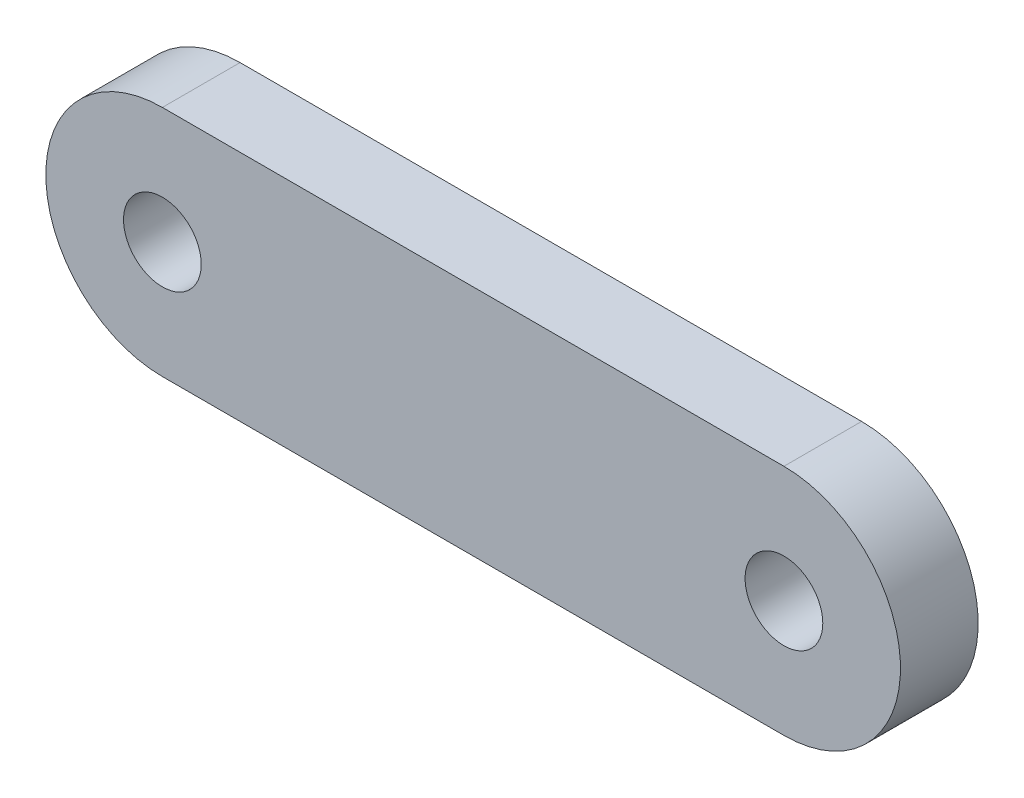
ISO-10303-21;
HEADER;
FILE_DESCRIPTION(('STEP AP214'),'2;1');
FILE_NAME('part.step','',(''),(''),'','','');
FILE_SCHEMA(('AUTOMOTIVE_DESIGN { 1 0 10303 214 1 1 1 1 }'));
ENDSEC;
DATA;
#1=APPLICATION_CONTEXT('core data for automotive mechanical design processes');
#2=APPLICATION_PROTOCOL_DEFINITION('international standard','automotive_design',2000,#1);
#3=PRODUCT_CONTEXT('',#1,'mechanical');
#4=PRODUCT('Part','Part','',(#3));
#5=PRODUCT_RELATED_PRODUCT_CATEGORY('part','',(#4));
#6=PRODUCT_DEFINITION_FORMATION('','',#4);
#7=PRODUCT_DEFINITION_CONTEXT('part definition',#1,'design');
#8=PRODUCT_DEFINITION('design','',#6,#7);
#9=PRODUCT_DEFINITION_SHAPE('','',#8);
#10=(LENGTH_UNIT() NAMED_UNIT(*) SI_UNIT(.MILLI.,.METRE.));
#11=(NAMED_UNIT(*) PLANE_ANGLE_UNIT() SI_UNIT($,.RADIAN.));
#12=(NAMED_UNIT(*) SI_UNIT($,.STERADIAN.) SOLID_ANGLE_UNIT());
#13=UNCERTAINTY_MEASURE_WITH_UNIT(LENGTH_MEASURE(1.E-05),#10,'distance_accuracy_value','');
#14=(GEOMETRIC_REPRESENTATION_CONTEXT(3) GLOBAL_UNCERTAINTY_ASSIGNED_CONTEXT((#13)) GLOBAL_UNIT_ASSIGNED_CONTEXT((#10,
#11,#12)) REPRESENTATION_CONTEXT('',''));
#15=CARTESIAN_POINT('',(0.,0.,0.));
#16=DIRECTION('',(0.,0.,1.));
#17=DIRECTION('',(1.,0.,0.));
#18=AXIS2_PLACEMENT_3D('',#15,#16,#17);
#19=CARTESIAN_POINT('',(-5.16354405438587,0.,1.));
#20=DIRECTION('',(0.,0.,1.));
#21=DIRECTION('',(1.,0.,0.));
#22=AXIS2_PLACEMENT_3D('',#19,#20,#21);
#23=PLANE('',#22);
#24=CARTESIAN_POINT('',(2.83645594561413,0.,1.));
#25=DIRECTION('',(0.,0.,1.));
#26=DIRECTION('',(1.,0.,0.));
#27=AXIS2_PLACEMENT_3D('',#24,#25,#26);
#28=CIRCLE('',#27,0.499999999999999);
#29=CARTESIAN_POINT('',(3.33645594561413,0.,1.));
#30=VERTEX_POINT('',#29);
#31=EDGE_CURVE('E99',#30,#30,#28,.T.);
#32=ORIENTED_EDGE('',*,*,#31,.F.);
#33=EDGE_LOOP('',(#32));
#34=FACE_BOUND('',#33,.T.);
#35=CARTESIAN_POINT('',(-5.16354405438587,0.,1.));
#36=DIRECTION('',(0.,0.,1.));
#37=DIRECTION('',(1.,0.,0.));
#38=AXIS2_PLACEMENT_3D('',#35,#36,#37);
#39=CIRCLE('',#38,1.5);
#40=CARTESIAN_POINT('',(-5.16354405438587,1.5,1.));
#41=VERTEX_POINT('',#40);
#42=CARTESIAN_POINT('',(-5.16354405438587,-1.5,1.));
#43=VERTEX_POINT('',#42);
#44=EDGE_CURVE('E84',#41,#43,#39,.T.);
#45=ORIENTED_EDGE('',*,*,#44,.T.);
#46=DIRECTION('',(1.,0.,0.));
#47=VECTOR('',#46,1.);
#48=CARTESIAN_POINT('',(-5.16354405438587,-1.5,1.));
#49=LINE('',#48,#47);
#50=CARTESIAN_POINT('',(2.83645594561413,-1.5,1.));
#51=VERTEX_POINT('',#50);
#52=EDGE_CURVE('E79',#43,#51,#49,.T.);
#53=ORIENTED_EDGE('',*,*,#52,.T.);
#54=CARTESIAN_POINT('',(2.83645594561413,0.,1.));
#55=DIRECTION('',(0.,0.,1.));
#56=DIRECTION('',(1.,0.,0.));
#57=AXIS2_PLACEMENT_3D('',#54,#55,#56);
#58=CIRCLE('',#57,1.5);
#59=CARTESIAN_POINT('',(2.83645594561413,1.5,1.));
#60=VERTEX_POINT('',#59);
#61=EDGE_CURVE('E82',#51,#60,#58,.T.);
#62=ORIENTED_EDGE('',*,*,#61,.T.);
#63=DIRECTION('',(-1.,0.,0.));
#64=VECTOR('',#63,1.);
#65=CARTESIAN_POINT('',(-5.16354405438587,1.5,1.));
#66=LINE('',#65,#64);
#67=EDGE_CURVE('E49',#60,#41,#66,.T.);
#68=ORIENTED_EDGE('',*,*,#67,.T.);
#69=EDGE_LOOP('',(#45,#53,#62,#68));
#70=FACE_BOUND('',#69,.T.);
#71=CARTESIAN_POINT('',(-5.16354405438587,0.,1.));
#72=DIRECTION('',(0.,0.,1.));
#73=DIRECTION('',(1.,0.,0.));
#74=AXIS2_PLACEMENT_3D('',#71,#72,#73);
#75=CIRCLE('',#74,0.500000000000001);
#76=CARTESIAN_POINT('',(-4.66354405438587,0.,1.));
#77=VERTEX_POINT('',#76);
#78=EDGE_CURVE('E114',#77,#77,#75,.T.);
#79=ORIENTED_EDGE('',*,*,#78,.F.);
#80=EDGE_LOOP('',(#79));
#81=FACE_BOUND('',#80,.T.);
#82=ADVANCED_FACE('F32',(#34,#70,#81),#23,.T.);
#83=CARTESIAN_POINT('',(-5.16354405438587,0.,0.));
#84=DIRECTION('',(0.,0.,1.));
#85=DIRECTION('',(1.,0.,0.));
#86=AXIS2_PLACEMENT_3D('',#83,#84,#85);
#87=PLANE('',#86);
#88=CARTESIAN_POINT('',(-5.16354405438587,0.,0.));
#89=DIRECTION('',(0.,0.,1.));
#90=DIRECTION('',(1.,0.,0.));
#91=AXIS2_PLACEMENT_3D('',#88,#89,#90);
#92=CIRCLE('',#91,1.5);
#93=CARTESIAN_POINT('',(-5.16354405438587,1.5,0.));
#94=VERTEX_POINT('',#93);
#95=CARTESIAN_POINT('',(-5.16354405438587,-1.5,0.));
#96=VERTEX_POINT('',#95);
#97=EDGE_CURVE('E96',#94,#96,#92,.T.);
#98=ORIENTED_EDGE('',*,*,#97,.F.);
#99=DIRECTION('',(-1.,0.,0.));
#100=VECTOR('',#99,1.);
#101=CARTESIAN_POINT('',(-5.16354405438587,1.5,0.));
#102=LINE('',#101,#100);
#103=CARTESIAN_POINT('',(2.83645594561413,1.5,0.));
#104=VERTEX_POINT('',#103);
#105=EDGE_CURVE('E72',#104,#94,#102,.T.);
#106=ORIENTED_EDGE('',*,*,#105,.F.);
#107=CARTESIAN_POINT('',(2.83645594561413,0.,0.));
#108=DIRECTION('',(0.,0.,1.));
#109=DIRECTION('',(1.,0.,0.));
#110=AXIS2_PLACEMENT_3D('',#107,#108,#109);
#111=CIRCLE('',#110,1.5);
#112=CARTESIAN_POINT('',(2.83645594561413,-1.5,0.));
#113=VERTEX_POINT('',#112);
#114=EDGE_CURVE('E66',#113,#104,#111,.T.);
#115=ORIENTED_EDGE('',*,*,#114,.F.);
#116=DIRECTION('',(1.,0.,0.));
#117=VECTOR('',#116,1.);
#118=CARTESIAN_POINT('',(-5.16354405438587,-1.5,0.));
#119=LINE('',#118,#117);
#120=EDGE_CURVE('E88',#96,#113,#119,.T.);
#121=ORIENTED_EDGE('',*,*,#120,.F.);
#122=EDGE_LOOP('',(#98,#106,#115,#121));
#123=FACE_BOUND('',#122,.T.);
#124=CARTESIAN_POINT('',(2.83645594561413,0.,0.));
#125=DIRECTION('',(0.,0.,1.));
#126=DIRECTION('',(1.,0.,0.));
#127=AXIS2_PLACEMENT_3D('',#124,#125,#126);
#128=CIRCLE('',#127,0.499999999999999);
#129=CARTESIAN_POINT('',(3.33645594561413,0.,0.));
#130=VERTEX_POINT('',#129);
#131=EDGE_CURVE('E111',#130,#130,#128,.T.);
#132=ORIENTED_EDGE('',*,*,#131,.T.);
#133=EDGE_LOOP('',(#132));
#134=FACE_BOUND('',#133,.T.);
#135=CARTESIAN_POINT('',(-5.16354405438587,0.,0.));
#136=DIRECTION('',(0.,0.,1.));
#137=DIRECTION('',(1.,0.,0.));
#138=AXIS2_PLACEMENT_3D('',#135,#136,#137);
#139=CIRCLE('',#138,0.500000000000001);
#140=CARTESIAN_POINT('',(-4.66354405438587,0.,0.));
#141=VERTEX_POINT('',#140);
#142=EDGE_CURVE('E117',#141,#141,#139,.T.);
#143=ORIENTED_EDGE('',*,*,#142,.T.);
#144=EDGE_LOOP('',(#143));
#145=FACE_BOUND('',#144,.T.);
#146=ADVANCED_FACE('F107',(#123,#134,#145),#87,.F.);
#147=CARTESIAN_POINT('',(-5.16354405438587,0.,1.));
#148=DIRECTION('',(0.,0.,-1.));
#149=DIRECTION('',(-1.,0.,0.));
#150=AXIS2_PLACEMENT_3D('',#147,#148,#149);
#151=CYLINDRICAL_SURFACE('',#150,1.5);
#152=ORIENTED_EDGE('',*,*,#97,.T.);
#153=DIRECTION('',(0.,0.,-1.));
#154=VECTOR('',#153,1.);
#155=CARTESIAN_POINT('',(-5.16354405438587,-1.5,1.));
#156=LINE('',#155,#154);
#157=EDGE_CURVE('E11',#43,#96,#156,.T.);
#158=ORIENTED_EDGE('',*,*,#157,.F.);
#159=ORIENTED_EDGE('',*,*,#44,.F.);
#160=DIRECTION('',(0.,0.,-1.));
#161=VECTOR('',#160,1.);
#162=CARTESIAN_POINT('',(-5.16354405438587,1.5,1.));
#163=LINE('',#162,#161);
#164=EDGE_CURVE('E92',#41,#94,#163,.T.);
#165=ORIENTED_EDGE('',*,*,#164,.T.);
#166=EDGE_LOOP('',(#152,#158,#159,#165));
#167=FACE_BOUND('',#166,.T.);
#168=ADVANCED_FACE('F34',(#167),#151,.T.);
#169=CARTESIAN_POINT('',(-5.16354405438587,-1.5,1.));
#170=DIRECTION('',(0.,1.,0.));
#171=DIRECTION('',(0.,0.,1.));
#172=AXIS2_PLACEMENT_3D('',#169,#170,#171);
#173=PLANE('',#172);
#174=ORIENTED_EDGE('',*,*,#120,.T.);
#175=DIRECTION('',(0.,0.,-1.));
#176=VECTOR('',#175,1.);
#177=CARTESIAN_POINT('',(2.83645594561413,-1.5,1.));
#178=LINE('',#177,#176);
#179=EDGE_CURVE('E41',#51,#113,#178,.T.);
#180=ORIENTED_EDGE('',*,*,#179,.F.);
#181=ORIENTED_EDGE('',*,*,#52,.F.);
#182=ORIENTED_EDGE('',*,*,#157,.T.);
#183=EDGE_LOOP('',(#174,#180,#181,#182));
#184=FACE_BOUND('',#183,.T.);
#185=ADVANCED_FACE('F87',(#184),#173,.F.);
#186=CARTESIAN_POINT('',(2.83645594561413,0.,1.));
#187=DIRECTION('',(0.,0.,-1.));
#188=DIRECTION('',(-1.,0.,0.));
#189=AXIS2_PLACEMENT_3D('',#186,#187,#188);
#190=CYLINDRICAL_SURFACE('',#189,1.5);
#191=ORIENTED_EDGE('',*,*,#114,.T.);
#192=DIRECTION('',(0.,0.,-1.));
#193=VECTOR('',#192,1.);
#194=CARTESIAN_POINT('',(2.83645594561413,1.5,1.));
#195=LINE('',#194,#193);
#196=EDGE_CURVE('E89',#60,#104,#195,.T.);
#197=ORIENTED_EDGE('',*,*,#196,.F.);
#198=ORIENTED_EDGE('',*,*,#61,.F.);
#199=ORIENTED_EDGE('',*,*,#179,.T.);
#200=EDGE_LOOP('',(#191,#197,#198,#199));
#201=FACE_BOUND('',#200,.T.);
#202=ADVANCED_FACE('F90',(#201),#190,.T.);
#203=CARTESIAN_POINT('',(-5.16354405438587,1.5,1.));
#204=DIRECTION('',(0.,-1.,0.));
#205=DIRECTION('',(0.,0.,-1.));
#206=AXIS2_PLACEMENT_3D('',#203,#204,#205);
#207=PLANE('',#206);
#208=ORIENTED_EDGE('',*,*,#105,.T.);
#209=ORIENTED_EDGE('',*,*,#164,.F.);
#210=ORIENTED_EDGE('',*,*,#67,.F.);
#211=ORIENTED_EDGE('',*,*,#196,.T.);
#212=EDGE_LOOP('',(#208,#209,#210,#211));
#213=FACE_BOUND('',#212,.T.);
#214=ADVANCED_FACE('F104',(#213),#207,.F.);
#215=CARTESIAN_POINT('',(2.83645594561413,0.,1.));
#216=DIRECTION('',(0.,0.,-1.));
#217=DIRECTION('',(-1.,0.,0.));
#218=AXIS2_PLACEMENT_3D('',#215,#216,#217);
#219=CYLINDRICAL_SURFACE('',#218,0.499999999999999);
#220=ORIENTED_EDGE('',*,*,#31,.T.);
#221=EDGE_LOOP('',(#220));
#222=FACE_BOUND('',#221,.T.);
#223=ORIENTED_EDGE('',*,*,#131,.F.);
#224=EDGE_LOOP('',(#223));
#225=FACE_BOUND('',#224,.T.);
#226=ADVANCED_FACE('F134',(#222,#225),#219,.F.);
#227=CARTESIAN_POINT('',(-5.16354405438587,0.,1.));
#228=DIRECTION('',(0.,0.,-1.));
#229=DIRECTION('',(-1.,0.,0.));
#230=AXIS2_PLACEMENT_3D('',#227,#228,#229);
#231=CYLINDRICAL_SURFACE('',#230,0.500000000000001);
#232=ORIENTED_EDGE('',*,*,#78,.T.);
#233=EDGE_LOOP('',(#232));
#234=FACE_BOUND('',#233,.T.);
#235=ORIENTED_EDGE('',*,*,#142,.F.);
#236=EDGE_LOOP('',(#235));
#237=FACE_BOUND('',#236,.T.);
#238=ADVANCED_FACE('F123',(#234,#237),#231,.F.);
#239=CLOSED_SHELL('',(#82,#146,#168,#185,#202,#214,#226,#238));
#240=MANIFOLD_SOLID_BREP('B2',#239);
#241=ADVANCED_BREP_SHAPE_REPRESENTATION('',(#18,#240),#14);
#242=SHAPE_DEFINITION_REPRESENTATION(#9,#241);
ENDSEC;
END-ISO-10303-21;
